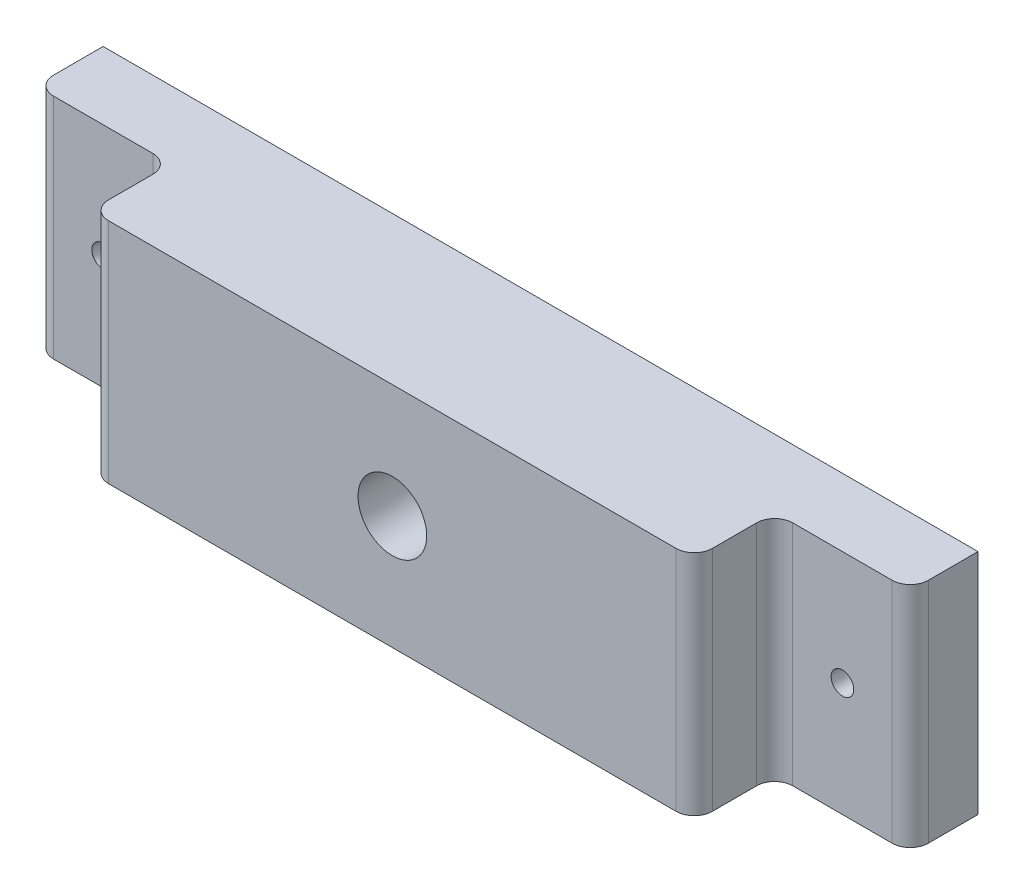
ISO-10303-21;
HEADER;
FILE_DESCRIPTION(('STEP AP214'),'2;1');
FILE_NAME('part.step','',(''),(''),'','','');
FILE_SCHEMA(('AUTOMOTIVE_DESIGN { 1 0 10303 214 1 1 1 1 }'));
ENDSEC;
DATA;
#1=APPLICATION_CONTEXT('core data for automotive mechanical design processes');
#2=APPLICATION_PROTOCOL_DEFINITION('international standard','automotive_design',2000,#1);
#3=PRODUCT_CONTEXT('',#1,'mechanical');
#4=PRODUCT('Part','Part','',(#3));
#5=PRODUCT_RELATED_PRODUCT_CATEGORY('part','',(#4));
#6=PRODUCT_DEFINITION_FORMATION('','',#4);
#7=PRODUCT_DEFINITION_CONTEXT('part definition',#1,'design');
#8=PRODUCT_DEFINITION('design','',#6,#7);
#9=PRODUCT_DEFINITION_SHAPE('','',#8);
#10=(LENGTH_UNIT() NAMED_UNIT(*) SI_UNIT(.MILLI.,.METRE.));
#11=(NAMED_UNIT(*) PLANE_ANGLE_UNIT() SI_UNIT($,.RADIAN.));
#12=(NAMED_UNIT(*) SI_UNIT($,.STERADIAN.) SOLID_ANGLE_UNIT());
#13=UNCERTAINTY_MEASURE_WITH_UNIT(LENGTH_MEASURE(1.E-05),#10,'distance_accuracy_value','');
#14=(GEOMETRIC_REPRESENTATION_CONTEXT(3) GLOBAL_UNCERTAINTY_ASSIGNED_CONTEXT((#13)) GLOBAL_UNIT_ASSIGNED_CONTEXT((#10,
#11,#12)) REPRESENTATION_CONTEXT('',''));
#15=CARTESIAN_POINT('',(0.,0.,0.));
#16=DIRECTION('',(0.,0.,1.));
#17=DIRECTION('',(1.,0.,0.));
#18=AXIS2_PLACEMENT_3D('',#15,#16,#17);
#19=CARTESIAN_POINT('',(0.,16.002,0.835084905660375));
#20=DIRECTION('',(0.,0.,-1.));
#21=DIRECTION('',(-1.,0.,0.));
#22=AXIS2_PLACEMENT_3D('',#19,#20,#21);
#23=PLANE('',#22);
#24=CARTESIAN_POINT('',(4.40426415094339,8.001,0.835084905660375));
#25=DIRECTION('',(0.,0.,1.));
#26=DIRECTION('',(1.,0.,0.));
#27=AXIS2_PLACEMENT_3D('',#24,#25,#26);
#28=CIRCLE('',#27,2.413);
#29=CARTESIAN_POINT('',(6.81726415094339,8.001,0.835084905660375));
#30=VERTEX_POINT('',#29);
#31=EDGE_CURVE('E293',#30,#30,#28,.T.);
#32=ORIENTED_EDGE('',*,*,#31,.F.);
#33=EDGE_LOOP('',(#32));
#34=FACE_BOUND('',#33,.T.);
#35=DIRECTION('',(1.,0.,0.));
#36=VECTOR('',#35,1.);
#37=CARTESIAN_POINT('',(0.,0.,0.835084905660375));
#38=LINE('',#37,#36);
#39=CARTESIAN_POINT('',(-15.5347358490566,0.,0.835084905660374));
#40=VERTEX_POINT('',#39);
#41=CARTESIAN_POINT('',(24.3432641509434,0.,0.835084905660377));
#42=VERTEX_POINT('',#41);
#43=EDGE_CURVE('E176',#40,#42,#38,.T.);
#44=ORIENTED_EDGE('',*,*,#43,.T.);
#45=DIRECTION('',(0.,-1.,0.));
#46=VECTOR('',#45,1.);
#47=CARTESIAN_POINT('',(24.3432641509434,16.002,0.835084905660377));
#48=LINE('',#47,#46);
#49=CARTESIAN_POINT('',(24.3432641509434,16.002,0.835084905660377));
#50=VERTEX_POINT('',#49);
#51=EDGE_CURVE('E237',#42,#50,#48,.F.);
#52=ORIENTED_EDGE('',*,*,#51,.T.);
#53=DIRECTION('',(1.,0.,0.));
#54=VECTOR('',#53,1.);
#55=CARTESIAN_POINT('',(0.,16.002,0.835084905660375));
#56=LINE('',#55,#54);
#57=CARTESIAN_POINT('',(-15.5347358490566,16.002,0.835084905660374));
#58=VERTEX_POINT('',#57);
#59=EDGE_CURVE('E197',#58,#50,#56,.T.);
#60=ORIENTED_EDGE('',*,*,#59,.F.);
#61=DIRECTION('',(0.,-1.,0.));
#62=VECTOR('',#61,1.);
#63=CARTESIAN_POINT('',(-15.5347358490566,16.002,0.835084905660374));
#64=LINE('',#63,#62);
#65=EDGE_CURVE('E234',#58,#40,#64,.T.);
#66=ORIENTED_EDGE('',*,*,#65,.T.);
#67=EDGE_LOOP('',(#44,#52,#60,#66));
#68=FACE_BOUND('',#67,.T.);
#69=ADVANCED_FACE('F36',(#34,#68),#23,.F.);
#70=CARTESIAN_POINT('',(25.6132641509434,16.002,0.));
#71=DIRECTION('',(1.,0.,0.));
#72=DIRECTION('',(0.,0.,-1.));
#73=AXIS2_PLACEMENT_3D('',#70,#71,#72);
#74=PLANE('',#73);
#75=DIRECTION('',(0.,0.,1.));
#76=VECTOR('',#75,1.);
#77=CARTESIAN_POINT('',(25.6132641509434,0.,0.));
#78=LINE('',#77,#76);
#79=CARTESIAN_POINT('',(25.6132641509434,0.,-3.54641509433962));
#80=VERTEX_POINT('',#79);
#81=CARTESIAN_POINT('',(25.6132641509434,0.,-0.434915094339623));
#82=VERTEX_POINT('',#81);
#83=EDGE_CURVE('E179',#80,#82,#78,.T.);
#84=ORIENTED_EDGE('',*,*,#83,.F.);
#85=DIRECTION('',(0.,-1.,0.));
#86=VECTOR('',#85,1.);
#87=CARTESIAN_POINT('',(25.6132641509434,16.002,-3.54641509433962));
#88=LINE('',#87,#86);
#89=CARTESIAN_POINT('',(25.6132641509434,16.002,-3.54641509433962));
#90=VERTEX_POINT('',#89);
#91=EDGE_CURVE('E232',#80,#90,#88,.F.);
#92=ORIENTED_EDGE('',*,*,#91,.T.);
#93=DIRECTION('',(0.,0.,1.));
#94=VECTOR('',#93,1.);
#95=CARTESIAN_POINT('',(25.6132641509434,16.002,0.));
#96=LINE('',#95,#94);
#97=CARTESIAN_POINT('',(25.6132641509434,16.002,-0.434915094339623));
#98=VERTEX_POINT('',#97);
#99=EDGE_CURVE('E167',#90,#98,#96,.T.);
#100=ORIENTED_EDGE('',*,*,#99,.T.);
#101=DIRECTION('',(0.,-1.,0.));
#102=VECTOR('',#101,1.);
#103=CARTESIAN_POINT('',(25.6132641509434,0.,-0.434915094339623));
#104=LINE('',#103,#102);
#105=EDGE_CURVE('E229',#98,#82,#104,.T.);
#106=ORIENTED_EDGE('',*,*,#105,.T.);
#107=EDGE_LOOP('',(#84,#92,#100,#106));
#108=FACE_BOUND('',#107,.T.);
#109=ADVANCED_FACE('F251',(#108),#74,.T.);
#110=CARTESIAN_POINT('',(0.,16.002,-4.81641509433962));
#111=DIRECTION('',(0.,0.,1.));
#112=DIRECTION('',(1.,0.,0.));
#113=AXIS2_PLACEMENT_3D('',#110,#111,#112);
#114=PLANE('',#113);
#115=CARTESIAN_POINT('',(30.3757641509434,8.00100000000018,-4.81641509433962));
#116=DIRECTION('',(0.,0.,1.));
#117=DIRECTION('',(-1.,0.,0.));
#118=AXIS2_PLACEMENT_3D('',#115,#116,#117);
#119=CIRCLE('',#118,0.793749999999998);
#120=CARTESIAN_POINT('',(31.1695141509434,8.00100000000018,-4.81641509433962));
#121=VERTEX_POINT('',#120);
#122=EDGE_CURVE('E299',#121,#121,#119,.T.);
#123=ORIENTED_EDGE('',*,*,#122,.F.);
#124=EDGE_LOOP('',(#123));
#125=FACE_BOUND('',#124,.T.);
#126=DIRECTION('',(-1.,0.,0.));
#127=VECTOR('',#126,1.);
#128=CARTESIAN_POINT('',(0.,0.,-4.81641509433962));
#129=LINE('',#128,#127);
#130=CARTESIAN_POINT('',(33.8682641509434,0.,-4.81641509433962));
#131=VERTEX_POINT('',#130);
#132=CARTESIAN_POINT('',(26.8832641509434,0.,-4.81641509433962));
#133=VERTEX_POINT('',#132);
#134=EDGE_CURVE('E183',#131,#133,#129,.T.);
#135=ORIENTED_EDGE('',*,*,#134,.F.);
#136=DIRECTION('',(0.,-1.,0.));
#137=VECTOR('',#136,1.);
#138=CARTESIAN_POINT('',(33.8682641509434,16.002,-4.81641509433962));
#139=LINE('',#138,#137);
#140=CARTESIAN_POINT('',(33.8682641509434,16.002,-4.81641509433962));
#141=VERTEX_POINT('',#140);
#142=EDGE_CURVE('E211',#131,#141,#139,.F.);
#143=ORIENTED_EDGE('',*,*,#142,.T.);
#144=DIRECTION('',(-1.,0.,0.));
#145=VECTOR('',#144,1.);
#146=CARTESIAN_POINT('',(0.,16.002,-4.81641509433962));
#147=LINE('',#146,#145);
#148=CARTESIAN_POINT('',(26.8832641509434,16.002,-4.81641509433962));
#149=VERTEX_POINT('',#148);
#150=EDGE_CURVE('E164',#141,#149,#147,.T.);
#151=ORIENTED_EDGE('',*,*,#150,.T.);
#152=DIRECTION('',(0.,-1.,0.));
#153=VECTOR('',#152,1.);
#154=CARTESIAN_POINT('',(26.8832641509434,0.,-4.81641509433962));
#155=LINE('',#154,#153);
#156=EDGE_CURVE('E208',#149,#133,#155,.T.);
#157=ORIENTED_EDGE('',*,*,#156,.T.);
#158=EDGE_LOOP('',(#135,#143,#151,#157));
#159=FACE_BOUND('',#158,.T.);
#160=ADVANCED_FACE('F258',(#125,#159),#114,.T.);
#161=CARTESIAN_POINT('',(35.1382641509434,16.002,0.));
#162=DIRECTION('',(1.,0.,0.));
#163=DIRECTION('',(0.,0.,-1.));
#164=AXIS2_PLACEMENT_3D('',#161,#162,#163);
#165=PLANE('',#164);
#166=DIRECTION('',(0.,0.,1.));
#167=VECTOR('',#166,1.);
#168=CARTESIAN_POINT('',(35.1382641509434,16.002,0.));
#169=LINE('',#168,#167);
#170=CARTESIAN_POINT('',(35.1382641509434,16.002,-9.57891509433962));
#171=VERTEX_POINT('',#170);
#172=CARTESIAN_POINT('',(35.1382641509434,16.002,-6.08641509433962));
#173=VERTEX_POINT('',#172);
#174=EDGE_CURVE('E143',#171,#173,#169,.T.);
#175=ORIENTED_EDGE('',*,*,#174,.T.);
#176=DIRECTION('',(0.,-1.,0.));
#177=VECTOR('',#176,1.);
#178=CARTESIAN_POINT('',(35.1382641509434,16.002,-6.08641509433962));
#179=LINE('',#178,#177);
#180=CARTESIAN_POINT('',(35.1382641509434,0.,-6.08641509433962));
#181=VERTEX_POINT('',#180);
#182=EDGE_CURVE('E149',#173,#181,#179,.T.);
#183=ORIENTED_EDGE('',*,*,#182,.T.);
#184=DIRECTION('',(0.,0.,1.));
#185=VECTOR('',#184,1.);
#186=CARTESIAN_POINT('',(35.1382641509434,0.,0.));
#187=LINE('',#186,#185);
#188=CARTESIAN_POINT('',(35.1382641509434,0.,-9.57891509433962));
#189=VERTEX_POINT('',#188);
#190=EDGE_CURVE('E146',#189,#181,#187,.T.);
#191=ORIENTED_EDGE('',*,*,#190,.F.);
#192=DIRECTION('',(0.,-1.,0.));
#193=VECTOR('',#192,1.);
#194=CARTESIAN_POINT('',(35.1382641509434,16.002,-9.57891509433962));
#195=LINE('',#194,#193);
#196=EDGE_CURVE('E138',#171,#189,#195,.T.);
#197=ORIENTED_EDGE('',*,*,#196,.F.);
#198=EDGE_LOOP('',(#175,#183,#191,#197));
#199=FACE_BOUND('',#198,.T.);
#200=ADVANCED_FACE('F140',(#199),#165,.T.);
#201=CARTESIAN_POINT('',(0.,16.002,-9.57891509433962));
#202=DIRECTION('',(0.,0.,1.));
#203=DIRECTION('',(1.,0.,0.));
#204=AXIS2_PLACEMENT_3D('',#201,#202,#203);
#205=PLANE('',#204);
#206=CARTESIAN_POINT('',(-21.5672358490566,8.001,-9.57891509433962));
#207=DIRECTION('',(0.,0.,1.));
#208=DIRECTION('',(1.,0.,0.));
#209=AXIS2_PLACEMENT_3D('',#206,#207,#208);
#210=CIRCLE('',#209,0.793749999999999);
#211=CARTESIAN_POINT('',(-20.7734858490566,8.001,-9.57891509433962));
#212=VERTEX_POINT('',#211);
#213=EDGE_CURVE('E296',#212,#212,#210,.T.);
#214=ORIENTED_EDGE('',*,*,#213,.T.);
#215=EDGE_LOOP('',(#214));
#216=FACE_BOUND('',#215,.T.);
#217=CARTESIAN_POINT('',(30.3757641509434,8.00100000000018,-9.57891509433962));
#218=DIRECTION('',(0.,0.,1.));
#219=DIRECTION('',(-1.,0.,0.));
#220=AXIS2_PLACEMENT_3D('',#217,#218,#219);
#221=CIRCLE('',#220,0.793749999999998);
#222=CARTESIAN_POINT('',(31.1695141509434,8.00100000000018,-9.57891509433962));
#223=VERTEX_POINT('',#222);
#224=EDGE_CURVE('E302',#223,#223,#221,.T.);
#225=ORIENTED_EDGE('',*,*,#224,.T.);
#226=EDGE_LOOP('',(#225));
#227=FACE_BOUND('',#226,.T.);
#228=CARTESIAN_POINT('',(4.40426415094339,8.001,-9.57891509433962));
#229=DIRECTION('',(0.,0.,1.));
#230=DIRECTION('',(1.,0.,0.));
#231=AXIS2_PLACEMENT_3D('',#228,#229,#230);
#232=CIRCLE('',#231,2.413);
#233=CARTESIAN_POINT('',(6.81726415094339,8.001,-9.57891509433962));
#234=VERTEX_POINT('',#233);
#235=EDGE_CURVE('E180',#234,#234,#232,.T.);
#236=ORIENTED_EDGE('',*,*,#235,.T.);
#237=EDGE_LOOP('',(#236));
#238=FACE_BOUND('',#237,.T.);
#239=DIRECTION('',(-1.,0.,0.));
#240=VECTOR('',#239,1.);
#241=CARTESIAN_POINT('',(0.,0.,-9.57891509433962));
#242=LINE('',#241,#240);
#243=CARTESIAN_POINT('',(-26.3297358490566,0.,-9.57891509433962));
#244=VERTEX_POINT('',#243);
#245=EDGE_CURVE('E187',#189,#244,#242,.T.);
#246=ORIENTED_EDGE('',*,*,#245,.T.);
#247=DIRECTION('',(0.,-1.,0.));
#248=VECTOR('',#247,1.);
#249=CARTESIAN_POINT('',(-26.3297358490566,16.002,-9.57891509433962));
#250=LINE('',#249,#248);
#251=CARTESIAN_POINT('',(-26.3297358490566,16.002,-9.57891509433962));
#252=VERTEX_POINT('',#251);
#253=EDGE_CURVE('E150',#252,#244,#250,.T.);
#254=ORIENTED_EDGE('',*,*,#253,.F.);
#255=DIRECTION('',(-1.,0.,0.));
#256=VECTOR('',#255,1.);
#257=CARTESIAN_POINT('',(0.,16.002,-9.57891509433962));
#258=LINE('',#257,#256);
#259=EDGE_CURVE('E153',#171,#252,#258,.T.);
#260=ORIENTED_EDGE('',*,*,#259,.F.);
#261=ORIENTED_EDGE('',*,*,#196,.T.);
#262=EDGE_LOOP('',(#246,#254,#260,#261));
#263=FACE_BOUND('',#262,.T.);
#264=ADVANCED_FACE('F154',(#216,#227,#238,#263),#205,.F.);
#265=CARTESIAN_POINT('',(-26.3297358490566,16.002,0.));
#266=DIRECTION('',(1.,0.,0.));
#267=DIRECTION('',(0.,0.,-1.));
#268=AXIS2_PLACEMENT_3D('',#265,#266,#267);
#269=PLANE('',#268);
#270=DIRECTION('',(0.,0.,1.));
#271=VECTOR('',#270,1.);
#272=CARTESIAN_POINT('',(-26.3297358490566,0.,0.));
#273=LINE('',#272,#271);
#274=CARTESIAN_POINT('',(-26.3297358490566,0.,-6.08641509433962));
#275=VERTEX_POINT('',#274);
#276=EDGE_CURVE('E189',#244,#275,#273,.T.);
#277=ORIENTED_EDGE('',*,*,#276,.T.);
#278=DIRECTION('',(0.,-1.,0.));
#279=VECTOR('',#278,1.);
#280=CARTESIAN_POINT('',(-26.3297358490566,16.002,-6.08641509433962));
#281=LINE('',#280,#279);
#282=CARTESIAN_POINT('',(-26.3297358490566,16.002,-6.08641509433962));
#283=VERTEX_POINT('',#282);
#284=EDGE_CURVE('E239',#275,#283,#281,.F.);
#285=ORIENTED_EDGE('',*,*,#284,.T.);
#286=DIRECTION('',(0.,0.,1.));
#287=VECTOR('',#286,1.);
#288=CARTESIAN_POINT('',(-26.3297358490566,16.002,0.));
#289=LINE('',#288,#287);
#290=EDGE_CURVE('E158',#252,#283,#289,.T.);
#291=ORIENTED_EDGE('',*,*,#290,.F.);
#292=ORIENTED_EDGE('',*,*,#253,.T.);
#293=EDGE_LOOP('',(#277,#285,#291,#292));
#294=FACE_BOUND('',#293,.T.);
#295=ADVANCED_FACE('F264',(#294),#269,.F.);
#296=CARTESIAN_POINT('',(0.,16.002,-4.81641509433962));
#297=DIRECTION('',(0.,0.,-1.));
#298=DIRECTION('',(-1.,0.,0.));
#299=AXIS2_PLACEMENT_3D('',#296,#297,#298);
#300=PLANE('',#299);
#301=CARTESIAN_POINT('',(-21.5672358490566,8.001,-4.81641509433962));
#302=DIRECTION('',(0.,0.,1.));
#303=DIRECTION('',(1.,0.,0.));
#304=AXIS2_PLACEMENT_3D('',#301,#302,#303);
#305=CIRCLE('',#304,0.793749999999999);
#306=CARTESIAN_POINT('',(-20.7734858490566,8.001,-4.81641509433962));
#307=VERTEX_POINT('',#306);
#308=EDGE_CURVE('E305',#307,#307,#305,.T.);
#309=ORIENTED_EDGE('',*,*,#308,.F.);
#310=EDGE_LOOP('',(#309));
#311=FACE_BOUND('',#310,.T.);
#312=DIRECTION('',(1.,0.,0.));
#313=VECTOR('',#312,1.);
#314=CARTESIAN_POINT('',(0.,0.,-4.81641509433962));
#315=LINE('',#314,#313);
#316=CARTESIAN_POINT('',(-25.0597358490566,0.,-4.81641509433962));
#317=VERTEX_POINT('',#316);
#318=CARTESIAN_POINT('',(-18.0747358490566,0.,-4.81641509433962));
#319=VERTEX_POINT('',#318);
#320=EDGE_CURVE('E192',#317,#319,#315,.T.);
#321=ORIENTED_EDGE('',*,*,#320,.T.);
#322=DIRECTION('',(0.,-1.,0.));
#323=VECTOR('',#322,1.);
#324=CARTESIAN_POINT('',(-18.0747358490566,16.002,-4.81641509433962));
#325=LINE('',#324,#323);
#326=CARTESIAN_POINT('',(-18.0747358490566,16.002,-4.81641509433962));
#327=VERTEX_POINT('',#326);
#328=EDGE_CURVE('E227',#319,#327,#325,.F.);
#329=ORIENTED_EDGE('',*,*,#328,.T.);
#330=DIRECTION('',(1.,0.,0.));
#331=VECTOR('',#330,1.);
#332=CARTESIAN_POINT('',(0.,16.002,-4.81641509433962));
#333=LINE('',#332,#331);
#334=CARTESIAN_POINT('',(-25.0597358490566,16.002,-4.81641509433962));
#335=VERTEX_POINT('',#334);
#336=EDGE_CURVE('E172',#335,#327,#333,.T.);
#337=ORIENTED_EDGE('',*,*,#336,.F.);
#338=DIRECTION('',(0.,-1.,0.));
#339=VECTOR('',#338,1.);
#340=CARTESIAN_POINT('',(-25.0597358490566,16.002,-4.81641509433962));
#341=LINE('',#340,#339);
#342=EDGE_CURVE('E224',#335,#317,#341,.T.);
#343=ORIENTED_EDGE('',*,*,#342,.T.);
#344=EDGE_LOOP('',(#321,#329,#337,#343));
#345=FACE_BOUND('',#344,.T.);
#346=ADVANCED_FACE('F272',(#311,#345),#300,.F.);
#347=CARTESIAN_POINT('',(-16.8047358490566,16.002,0.));
#348=DIRECTION('',(1.,0.,0.));
#349=DIRECTION('',(0.,0.,-1.));
#350=AXIS2_PLACEMENT_3D('',#347,#348,#349);
#351=PLANE('',#350);
#352=DIRECTION('',(0.,0.,1.));
#353=VECTOR('',#352,1.);
#354=CARTESIAN_POINT('',(-16.8047358490566,16.002,0.));
#355=LINE('',#354,#353);
#356=CARTESIAN_POINT('',(-16.8047358490566,16.002,-3.54641509433962));
#357=VERTEX_POINT('',#356);
#358=CARTESIAN_POINT('',(-16.8047358490566,16.002,-0.434915094339626));
#359=VERTEX_POINT('',#358);
#360=EDGE_CURVE('E174',#357,#359,#355,.T.);
#361=ORIENTED_EDGE('',*,*,#360,.F.);
#362=DIRECTION('',(0.,-1.,0.));
#363=VECTOR('',#362,1.);
#364=CARTESIAN_POINT('',(-16.8047358490566,0.,-3.54641509433962));
#365=LINE('',#364,#363);
#366=CARTESIAN_POINT('',(-16.8047358490566,0.,-3.54641509433962));
#367=VERTEX_POINT('',#366);
#368=EDGE_CURVE('E221',#357,#367,#365,.T.);
#369=ORIENTED_EDGE('',*,*,#368,.T.);
#370=DIRECTION('',(0.,0.,1.));
#371=VECTOR('',#370,1.);
#372=CARTESIAN_POINT('',(-16.8047358490566,0.,0.));
#373=LINE('',#372,#371);
#374=CARTESIAN_POINT('',(-16.8047358490566,0.,-0.434915094339626));
#375=VERTEX_POINT('',#374);
#376=EDGE_CURVE('E195',#367,#375,#373,.T.);
#377=ORIENTED_EDGE('',*,*,#376,.T.);
#378=DIRECTION('',(0.,-1.,0.));
#379=VECTOR('',#378,1.);
#380=CARTESIAN_POINT('',(-16.8047358490566,16.002,-0.434915094339626));
#381=LINE('',#380,#379);
#382=EDGE_CURVE('E51',#375,#359,#381,.F.);
#383=ORIENTED_EDGE('',*,*,#382,.T.);
#384=EDGE_LOOP('',(#361,#369,#377,#383));
#385=FACE_BOUND('',#384,.T.);
#386=ADVANCED_FACE('F278',(#385),#351,.F.);
#387=CARTESIAN_POINT('',(0.,16.002,0.));
#388=DIRECTION('',(0.,1.,0.));
#389=DIRECTION('',(0.,0.,1.));
#390=AXIS2_PLACEMENT_3D('',#387,#388,#389);
#391=PLANE('',#390);
#392=ORIENTED_EDGE('',*,*,#150,.F.);
#393=CARTESIAN_POINT('',(33.8682641509434,16.002,-6.08641509433962));
#394=DIRECTION('',(0.,1.,0.));
#395=DIRECTION('',(0.,0.,1.));
#396=AXIS2_PLACEMENT_3D('',#393,#394,#395);
#397=CIRCLE('',#396,1.27);
#398=EDGE_CURVE('E163',#141,#173,#397,.T.);
#399=ORIENTED_EDGE('',*,*,#398,.T.);
#400=ORIENTED_EDGE('',*,*,#174,.F.);
#401=ORIENTED_EDGE('',*,*,#259,.T.);
#402=ORIENTED_EDGE('',*,*,#290,.T.);
#403=CARTESIAN_POINT('',(-25.0597358490566,16.002,-6.08641509433962));
#404=DIRECTION('',(0.,1.,0.));
#405=DIRECTION('',(0.,0.,1.));
#406=AXIS2_PLACEMENT_3D('',#403,#404,#405);
#407=CIRCLE('',#406,1.27);
#408=EDGE_CURVE('E213',#283,#335,#407,.T.);
#409=ORIENTED_EDGE('',*,*,#408,.T.);
#410=ORIENTED_EDGE('',*,*,#336,.T.);
#411=CARTESIAN_POINT('',(-18.0747358490566,16.002,-3.54641509433962));
#412=DIRECTION('',(0.,1.,0.));
#413=DIRECTION('',(0.,0.,1.));
#414=AXIS2_PLACEMENT_3D('',#411,#412,#413);
#415=CIRCLE('',#414,1.27);
#416=EDGE_CURVE('E58',#327,#357,#415,.F.);
#417=ORIENTED_EDGE('',*,*,#416,.T.);
#418=ORIENTED_EDGE('',*,*,#360,.T.);
#419=CARTESIAN_POINT('',(-15.5347358490566,16.002,-0.434915094339626));
#420=DIRECTION('',(0.,1.,0.));
#421=DIRECTION('',(0.,0.,1.));
#422=AXIS2_PLACEMENT_3D('',#419,#420,#421);
#423=CIRCLE('',#422,1.27);
#424=EDGE_CURVE('E215',#359,#58,#423,.T.);
#425=ORIENTED_EDGE('',*,*,#424,.T.);
#426=ORIENTED_EDGE('',*,*,#59,.T.);
#427=CARTESIAN_POINT('',(24.3432641509434,16.002,-0.434915094339623));
#428=DIRECTION('',(0.,1.,0.));
#429=DIRECTION('',(0.,0.,1.));
#430=AXIS2_PLACEMENT_3D('',#427,#428,#429);
#431=CIRCLE('',#430,1.27);
#432=EDGE_CURVE('E217',#50,#98,#431,.T.);
#433=ORIENTED_EDGE('',*,*,#432,.T.);
#434=ORIENTED_EDGE('',*,*,#99,.F.);
#435=CARTESIAN_POINT('',(26.8832641509434,16.002,-3.54641509433962));
#436=DIRECTION('',(0.,1.,0.));
#437=DIRECTION('',(0.,0.,1.));
#438=AXIS2_PLACEMENT_3D('',#435,#436,#437);
#439=CIRCLE('',#438,1.27);
#440=EDGE_CURVE('E12',#90,#149,#439,.F.);
#441=ORIENTED_EDGE('',*,*,#440,.T.);
#442=EDGE_LOOP('',(#392,#399,#400,#401,#402,#409,#410,#417,#418,#425,#426,#433,#434,#441));
#443=FACE_BOUND('',#442,.T.);
#444=ADVANCED_FACE('F161',(#443),#391,.T.);
#445=CARTESIAN_POINT('',(0.,0.,0.));
#446=DIRECTION('',(0.,1.,0.));
#447=DIRECTION('',(0.,0.,1.));
#448=AXIS2_PLACEMENT_3D('',#445,#446,#447);
#449=PLANE('',#448);
#450=ORIENTED_EDGE('',*,*,#190,.T.);
#451=CARTESIAN_POINT('',(33.8682641509434,0.,-6.08641509433962));
#452=DIRECTION('',(0.,1.,0.));
#453=DIRECTION('',(0.,0.,1.));
#454=AXIS2_PLACEMENT_3D('',#451,#452,#453);
#455=CIRCLE('',#454,1.27);
#456=EDGE_CURVE('E206',#181,#131,#455,.F.);
#457=ORIENTED_EDGE('',*,*,#456,.T.);
#458=ORIENTED_EDGE('',*,*,#134,.T.);
#459=CARTESIAN_POINT('',(26.8832641509434,0.,-3.54641509433962));
#460=DIRECTION('',(0.,1.,0.));
#461=DIRECTION('',(0.,0.,1.));
#462=AXIS2_PLACEMENT_3D('',#459,#460,#461);
#463=CIRCLE('',#462,1.27);
#464=EDGE_CURVE('E44',#133,#80,#463,.T.);
#465=ORIENTED_EDGE('',*,*,#464,.T.);
#466=ORIENTED_EDGE('',*,*,#83,.T.);
#467=CARTESIAN_POINT('',(24.3432641509434,0.,-0.434915094339623));
#468=DIRECTION('',(0.,1.,0.));
#469=DIRECTION('',(0.,0.,1.));
#470=AXIS2_PLACEMENT_3D('',#467,#468,#469);
#471=CIRCLE('',#470,1.27);
#472=EDGE_CURVE('E204',#82,#42,#471,.F.);
#473=ORIENTED_EDGE('',*,*,#472,.T.);
#474=ORIENTED_EDGE('',*,*,#43,.F.);
#475=CARTESIAN_POINT('',(-15.5347358490566,0.,-0.434915094339626));
#476=DIRECTION('',(0.,1.,0.));
#477=DIRECTION('',(0.,0.,1.));
#478=AXIS2_PLACEMENT_3D('',#475,#476,#477);
#479=CIRCLE('',#478,1.27);
#480=EDGE_CURVE('E202',#40,#375,#479,.F.);
#481=ORIENTED_EDGE('',*,*,#480,.T.);
#482=ORIENTED_EDGE('',*,*,#376,.F.);
#483=CARTESIAN_POINT('',(-18.0747358490566,0.,-3.54641509433962));
#484=DIRECTION('',(0.,1.,0.));
#485=DIRECTION('',(0.,0.,1.));
#486=AXIS2_PLACEMENT_3D('',#483,#484,#485);
#487=CIRCLE('',#486,1.27);
#488=EDGE_CURVE('E241',#367,#319,#487,.T.);
#489=ORIENTED_EDGE('',*,*,#488,.T.);
#490=ORIENTED_EDGE('',*,*,#320,.F.);
#491=CARTESIAN_POINT('',(-25.0597358490566,0.,-6.08641509433962));
#492=DIRECTION('',(0.,1.,0.));
#493=DIRECTION('',(0.,0.,1.));
#494=AXIS2_PLACEMENT_3D('',#491,#492,#493);
#495=CIRCLE('',#494,1.27);
#496=EDGE_CURVE('E200',#317,#275,#495,.F.);
#497=ORIENTED_EDGE('',*,*,#496,.T.);
#498=ORIENTED_EDGE('',*,*,#276,.F.);
#499=ORIENTED_EDGE('',*,*,#245,.F.);
#500=EDGE_LOOP('',(#450,#457,#458,#465,#466,#473,#474,#481,#482,#489,#490,#497,#498,#499));
#501=FACE_BOUND('',#500,.T.);
#502=ADVANCED_FACE('F245',(#501),#449,.F.);
#503=CARTESIAN_POINT('',(33.8682641509434,16.002,-6.08641509433962));
#504=DIRECTION('',(0.,-1.,0.));
#505=DIRECTION('',(0.,0.,-1.));
#506=AXIS2_PLACEMENT_3D('',#503,#504,#505);
#507=CYLINDRICAL_SURFACE('',#506,1.27);
#508=ORIENTED_EDGE('',*,*,#398,.F.);
#509=ORIENTED_EDGE('',*,*,#142,.F.);
#510=ORIENTED_EDGE('',*,*,#456,.F.);
#511=ORIENTED_EDGE('',*,*,#182,.F.);
#512=EDGE_LOOP('',(#508,#509,#510,#511));
#513=FACE_BOUND('',#512,.T.);
#514=ADVANCED_FACE('F261',(#513),#507,.T.);
#515=CARTESIAN_POINT('',(-18.0747358490566,16.002,-3.54641509433962));
#516=DIRECTION('',(0.,1.,0.));
#517=DIRECTION('',(0.,0.,1.));
#518=AXIS2_PLACEMENT_3D('',#515,#516,#517);
#519=CYLINDRICAL_SURFACE('',#518,1.27);
#520=ORIENTED_EDGE('',*,*,#416,.F.);
#521=ORIENTED_EDGE('',*,*,#328,.F.);
#522=ORIENTED_EDGE('',*,*,#488,.F.);
#523=ORIENTED_EDGE('',*,*,#368,.F.);
#524=EDGE_LOOP('',(#520,#521,#522,#523));
#525=FACE_BOUND('',#524,.T.);
#526=ADVANCED_FACE('F277',(#525),#519,.F.);
#527=CARTESIAN_POINT('',(26.8832641509434,16.002,-3.54641509433962));
#528=DIRECTION('',(0.,1.,0.));
#529=DIRECTION('',(0.,0.,1.));
#530=AXIS2_PLACEMENT_3D('',#527,#528,#529);
#531=CYLINDRICAL_SURFACE('',#530,1.27);
#532=ORIENTED_EDGE('',*,*,#440,.F.);
#533=ORIENTED_EDGE('',*,*,#91,.F.);
#534=ORIENTED_EDGE('',*,*,#464,.F.);
#535=ORIENTED_EDGE('',*,*,#156,.F.);
#536=EDGE_LOOP('',(#532,#533,#534,#535));
#537=FACE_BOUND('',#536,.T.);
#538=ADVANCED_FACE('F256',(#537),#531,.F.);
#539=CARTESIAN_POINT('',(24.3432641509434,16.002,-0.434915094339623));
#540=DIRECTION('',(0.,1.,0.));
#541=DIRECTION('',(0.,0.,1.));
#542=AXIS2_PLACEMENT_3D('',#539,#540,#541);
#543=CYLINDRICAL_SURFACE('',#542,1.27);
#544=ORIENTED_EDGE('',*,*,#432,.F.);
#545=ORIENTED_EDGE('',*,*,#51,.F.);
#546=ORIENTED_EDGE('',*,*,#472,.F.);
#547=ORIENTED_EDGE('',*,*,#105,.F.);
#548=EDGE_LOOP('',(#544,#545,#546,#547));
#549=FACE_BOUND('',#548,.T.);
#550=ADVANCED_FACE('F290',(#549),#543,.T.);
#551=CARTESIAN_POINT('',(-15.5347358490566,16.002,-0.434915094339626));
#552=DIRECTION('',(0.,-1.,0.));
#553=DIRECTION('',(0.,0.,-1.));
#554=AXIS2_PLACEMENT_3D('',#551,#552,#553);
#555=CYLINDRICAL_SURFACE('',#554,1.27);
#556=ORIENTED_EDGE('',*,*,#424,.F.);
#557=ORIENTED_EDGE('',*,*,#382,.F.);
#558=ORIENTED_EDGE('',*,*,#480,.F.);
#559=ORIENTED_EDGE('',*,*,#65,.F.);
#560=EDGE_LOOP('',(#556,#557,#558,#559));
#561=FACE_BOUND('',#560,.T.);
#562=ADVANCED_FACE('F284',(#561),#555,.T.);
#563=CARTESIAN_POINT('',(-25.0597358490566,16.002,-6.08641509433962));
#564=DIRECTION('',(0.,-1.,0.));
#565=DIRECTION('',(0.,0.,-1.));
#566=AXIS2_PLACEMENT_3D('',#563,#564,#565);
#567=CYLINDRICAL_SURFACE('',#566,1.27);
#568=ORIENTED_EDGE('',*,*,#408,.F.);
#569=ORIENTED_EDGE('',*,*,#284,.F.);
#570=ORIENTED_EDGE('',*,*,#496,.F.);
#571=ORIENTED_EDGE('',*,*,#342,.F.);
#572=EDGE_LOOP('',(#568,#569,#570,#571));
#573=FACE_BOUND('',#572,.T.);
#574=ADVANCED_FACE('F38',(#573),#567,.T.);
#575=CARTESIAN_POINT('',(4.40426415094339,8.001,-9.57891509433962));
#576=DIRECTION('',(0.,0.,1.));
#577=DIRECTION('',(1.,0.,0.));
#578=AXIS2_PLACEMENT_3D('',#575,#576,#577);
#579=CYLINDRICAL_SURFACE('',#578,2.413);
#580=ORIENTED_EDGE('',*,*,#235,.F.);
#581=EDGE_LOOP('',(#580));
#582=FACE_BOUND('',#581,.T.);
#583=ORIENTED_EDGE('',*,*,#31,.T.);
#584=EDGE_LOOP('',(#583));
#585=FACE_BOUND('',#584,.T.);
#586=ADVANCED_FACE('F317',(#582,#585),#579,.F.);
#587=CARTESIAN_POINT('',(-21.5672358490566,8.001,-9.57891509433962));
#588=DIRECTION('',(0.,0.,1.));
#589=DIRECTION('',(1.,0.,0.));
#590=AXIS2_PLACEMENT_3D('',#587,#588,#589);
#591=CYLINDRICAL_SURFACE('',#590,0.793749999999999);
#592=CARTESIAN_POINT('',(-20.7734858490566,8.001,-9.57891509433962));
#593=CARTESIAN_POINT('',(-20.7734858490566,8.001,-9.52930571933963));
#594=CARTESIAN_POINT('',(-20.7734858490566,8.001,-9.47969634433963));
#595=CARTESIAN_POINT('',(-20.7734858490566,8.001,-9.38047759433962));
#596=CARTESIAN_POINT('',(-20.7734858490566,8.001,-9.33086821933963));
#597=CARTESIAN_POINT('',(-20.7734858490566,8.001,-9.23164946933962));
#598=CARTESIAN_POINT('',(-20.7734858490566,8.001,-9.18204009433962));
#599=CARTESIAN_POINT('',(-20.7734858490566,8.001,-9.08282134433962));
#600=CARTESIAN_POINT('',(-20.7734858490566,8.001,-9.03321196933963));
#601=CARTESIAN_POINT('',(-20.7734858490566,8.001,-8.93399321933962));
#602=CARTESIAN_POINT('',(-20.7734858490566,8.001,-8.88438384433963));
#603=CARTESIAN_POINT('',(-20.7734858490566,8.001,-8.78516509433962));
#604=CARTESIAN_POINT('',(-20.7734858490566,8.001,-8.73555571933963));
#605=CARTESIAN_POINT('',(-20.7734858490566,8.001,-8.63633696933962));
#606=CARTESIAN_POINT('',(-20.7734858490566,8.001,-8.58672759433962));
#607=CARTESIAN_POINT('',(-20.7734858490566,8.001,-8.48750884433962));
#608=CARTESIAN_POINT('',(-20.7734858490566,8.001,-8.43789946933962));
#609=CARTESIAN_POINT('',(-20.7734858490566,8.001,-8.33868071933962));
#610=CARTESIAN_POINT('',(-20.7734858490566,8.001,-8.28907134433963));
#611=CARTESIAN_POINT('',(-20.7734858490566,8.001,-8.18985259433962));
#612=CARTESIAN_POINT('',(-20.7734858490566,8.001,-8.14024321933963));
#613=CARTESIAN_POINT('',(-20.7734858490566,8.001,-8.04102446933962));
#614=CARTESIAN_POINT('',(-20.7734858490566,8.001,-7.99141509433962));
#615=CARTESIAN_POINT('',(-20.7734858490566,8.001,-7.89219634433962));
#616=CARTESIAN_POINT('',(-20.7734858490566,8.001,-7.84258696933962));
#617=CARTESIAN_POINT('',(-20.7734858490566,8.001,-7.74336821933962));
#618=CARTESIAN_POINT('',(-20.7734858490566,8.001,-7.69375884433962));
#619=CARTESIAN_POINT('',(-20.7734858490566,8.001,-7.59454009433962));
#620=CARTESIAN_POINT('',(-20.7734858490566,8.001,-7.54493071933962));
#621=CARTESIAN_POINT('',(-20.7734858490566,8.001,-7.44571196933962));
#622=CARTESIAN_POINT('',(-20.7734858490566,8.001,-7.39610259433962));
#623=CARTESIAN_POINT('',(-20.7734858490566,8.001,-7.29688384433962));
#624=CARTESIAN_POINT('',(-20.7734858490566,8.001,-7.24727446933962));
#625=CARTESIAN_POINT('',(-20.7734858490566,8.001,-7.14805571933962));
#626=CARTESIAN_POINT('',(-20.7734858490566,8.001,-7.09844634433962));
#627=CARTESIAN_POINT('',(-20.7734858490566,8.001,-6.99922759433962));
#628=CARTESIAN_POINT('',(-20.7734858490566,8.001,-6.94961821933962));
#629=CARTESIAN_POINT('',(-20.7734858490566,8.001,-6.85039946933962));
#630=CARTESIAN_POINT('',(-20.7734858490566,8.001,-6.80079009433962));
#631=CARTESIAN_POINT('',(-20.7734858490566,8.001,-6.70157134433962));
#632=CARTESIAN_POINT('',(-20.7734858490566,8.001,-6.65196196933962));
#633=CARTESIAN_POINT('',(-20.7734858490566,8.001,-6.55274321933962));
#634=CARTESIAN_POINT('',(-20.7734858490566,8.001,-6.50313384433962));
#635=CARTESIAN_POINT('',(-20.7734858490566,8.001,-6.40391509433962));
#636=CARTESIAN_POINT('',(-20.7734858490566,8.001,-6.35430571933962));
#637=CARTESIAN_POINT('',(-20.7734858490566,8.001,-6.25508696933962));
#638=CARTESIAN_POINT('',(-20.7734858490566,8.001,-6.20547759433962));
#639=CARTESIAN_POINT('',(-20.7734858490566,8.001,-6.10625884433962));
#640=CARTESIAN_POINT('',(-20.7734858490566,8.001,-6.05664946933962));
#641=CARTESIAN_POINT('',(-20.7734858490566,8.001,-5.95743071933962));
#642=CARTESIAN_POINT('',(-20.7734858490566,8.001,-5.90782134433962));
#643=CARTESIAN_POINT('',(-20.7734858490566,8.001,-5.80860259433962));
#644=CARTESIAN_POINT('',(-20.7734858490566,8.001,-5.75899321933962));
#645=CARTESIAN_POINT('',(-20.7734858490566,8.001,-5.65977446933962));
#646=CARTESIAN_POINT('',(-20.7734858490566,8.001,-5.61016509433962));
#647=CARTESIAN_POINT('',(-20.7734858490566,8.001,-5.51094634433962));
#648=CARTESIAN_POINT('',(-20.7734858490566,8.001,-5.46133696933962));
#649=CARTESIAN_POINT('',(-20.7734858490566,8.001,-5.36211821933962));
#650=CARTESIAN_POINT('',(-20.7734858490566,8.001,-5.31250884433962));
#651=CARTESIAN_POINT('',(-20.7734858490566,8.001,-5.21329009433962));
#652=CARTESIAN_POINT('',(-20.7734858490566,8.001,-5.16368071933962));
#653=CARTESIAN_POINT('',(-20.7734858490566,8.001,-5.06446196933962));
#654=CARTESIAN_POINT('',(-20.7734858490566,8.001,-5.01485259433962));
#655=CARTESIAN_POINT('',(-20.7734858490566,8.001,-4.91563384433962));
#656=CARTESIAN_POINT('',(-20.7734858490566,8.001,-4.86602446933962));
#657=CARTESIAN_POINT('',(-20.7734858490566,8.001,-4.81641509433962));
#658=B_SPLINE_CURVE_WITH_KNOTS('',3,(#592,#593,#594,#595,#596,#597,#598,#599,#600,#601,#602,
#603,#604,#605,#606,#607,#608,#609,#610,#611,#612,#613,#614,#615,#616,#617,#618,#619,#620,#621,
#622,#623,#624,#625,#626,#627,#628,#629,#630,#631,#632,#633,#634,#635,#636,#637,#638,#639,#640,
#641,#642,#643,#644,#645,#646,#647,#648,#649,#650,#651,#652,#653,#654,#655,#656,#657),
.UNSPECIFIED.,.F.,.F.,(4,2,2,2,2,2,2,2,2,2,2,2,2,2,2,2,2,2,2,2,2,2,2,2,2,2,2,2,2,2,2,2,4),(0.,
0.148828125,0.29765625,0.446484375,0.5953125,0.744140625,0.892968750000001,1.041796875,1.190625,
1.339453125,1.48828125,1.637109375,1.7859375,1.934765625,2.08359375,2.232421875,2.38125,
2.530078125,2.67890625,2.827734375,2.9765625,3.125390625,3.27421875,3.423046875,3.571875,
3.720703125,3.86953125,4.018359375,4.1671875,4.316015625,4.46484375,4.613671875,4.7625),.UNSPECIFIED.);
#659=EDGE_CURVE('BSEAM313',#212,#307,#658,.T.);
#660=ORIENTED_EDGE('',*,*,#213,.F.);
#661=ORIENTED_EDGE('',*,*,#308,.T.);
#662=ORIENTED_EDGE('',*,*,#659,.T.);
#663=ORIENTED_EDGE('',*,*,#659,.F.);
#664=EDGE_LOOP('',(#660,#662,#661,#663));
#665=FACE_BOUND('',#664,.T.);
#666=ADVANCED_FACE('F313',(#665),#591,.F.);
#667=CARTESIAN_POINT('',(30.3757641509434,8.00100000000018,-9.57891509433962));
#668=DIRECTION('',(0.,0.,1.));
#669=DIRECTION('',(1.,0.,0.));
#670=AXIS2_PLACEMENT_3D('',#667,#668,#669);
#671=CYLINDRICAL_SURFACE('',#670,0.793749999999998);
#672=CARTESIAN_POINT('',(31.1695141509434,8.00100000000018,-9.57891509433962));
#673=CARTESIAN_POINT('',(31.1695141509434,8.00100000000018,-9.52930571933963));
#674=CARTESIAN_POINT('',(31.1695141509434,8.00100000000018,-9.47969634433963));
#675=CARTESIAN_POINT('',(31.1695141509434,8.00100000000018,-9.38047759433962));
#676=CARTESIAN_POINT('',(31.1695141509434,8.00100000000018,-9.33086821933963));
#677=CARTESIAN_POINT('',(31.1695141509434,8.00100000000018,-9.23164946933962));
#678=CARTESIAN_POINT('',(31.1695141509434,8.00100000000018,-9.18204009433962));
#679=CARTESIAN_POINT('',(31.1695141509434,8.00100000000018,-9.08282134433962));
#680=CARTESIAN_POINT('',(31.1695141509434,8.00100000000018,-9.03321196933963));
#681=CARTESIAN_POINT('',(31.1695141509434,8.00100000000018,-8.93399321933962));
#682=CARTESIAN_POINT('',(31.1695141509434,8.00100000000018,-8.88438384433963));
#683=CARTESIAN_POINT('',(31.1695141509434,8.00100000000018,-8.78516509433962));
#684=CARTESIAN_POINT('',(31.1695141509434,8.00100000000018,-8.73555571933963));
#685=CARTESIAN_POINT('',(31.1695141509434,8.00100000000018,-8.63633696933962));
#686=CARTESIAN_POINT('',(31.1695141509434,8.00100000000018,-8.58672759433962));
#687=CARTESIAN_POINT('',(31.1695141509434,8.00100000000018,-8.48750884433962));
#688=CARTESIAN_POINT('',(31.1695141509434,8.00100000000018,-8.43789946933962));
#689=CARTESIAN_POINT('',(31.1695141509434,8.00100000000018,-8.33868071933962));
#690=CARTESIAN_POINT('',(31.1695141509434,8.00100000000018,-8.28907134433963));
#691=CARTESIAN_POINT('',(31.1695141509434,8.00100000000018,-8.18985259433962));
#692=CARTESIAN_POINT('',(31.1695141509434,8.00100000000018,-8.14024321933963));
#693=CARTESIAN_POINT('',(31.1695141509434,8.00100000000018,-8.04102446933962));
#694=CARTESIAN_POINT('',(31.1695141509434,8.00100000000018,-7.99141509433962));
#695=CARTESIAN_POINT('',(31.1695141509434,8.00100000000018,-7.89219634433962));
#696=CARTESIAN_POINT('',(31.1695141509434,8.00100000000018,-7.84258696933962));
#697=CARTESIAN_POINT('',(31.1695141509434,8.00100000000018,-7.74336821933962));
#698=CARTESIAN_POINT('',(31.1695141509434,8.00100000000018,-7.69375884433962));
#699=CARTESIAN_POINT('',(31.1695141509434,8.00100000000018,-7.59454009433962));
#700=CARTESIAN_POINT('',(31.1695141509434,8.00100000000018,-7.54493071933962));
#701=CARTESIAN_POINT('',(31.1695141509434,8.00100000000018,-7.44571196933962));
#702=CARTESIAN_POINT('',(31.1695141509434,8.00100000000018,-7.39610259433962));
#703=CARTESIAN_POINT('',(31.1695141509434,8.00100000000018,-7.29688384433962));
#704=CARTESIAN_POINT('',(31.1695141509434,8.00100000000018,-7.24727446933962));
#705=CARTESIAN_POINT('',(31.1695141509434,8.00100000000018,-7.14805571933962));
#706=CARTESIAN_POINT('',(31.1695141509434,8.00100000000018,-7.09844634433962));
#707=CARTESIAN_POINT('',(31.1695141509434,8.00100000000018,-6.99922759433962));
#708=CARTESIAN_POINT('',(31.1695141509434,8.00100000000018,-6.94961821933962));
#709=CARTESIAN_POINT('',(31.1695141509434,8.00100000000018,-6.85039946933962));
#710=CARTESIAN_POINT('',(31.1695141509434,8.00100000000018,-6.80079009433962));
#711=CARTESIAN_POINT('',(31.1695141509434,8.00100000000018,-6.70157134433962));
#712=CARTESIAN_POINT('',(31.1695141509434,8.00100000000018,-6.65196196933962));
#713=CARTESIAN_POINT('',(31.1695141509434,8.00100000000018,-6.55274321933962));
#714=CARTESIAN_POINT('',(31.1695141509434,8.00100000000018,-6.50313384433962));
#715=CARTESIAN_POINT('',(31.1695141509434,8.00100000000018,-6.40391509433962));
#716=CARTESIAN_POINT('',(31.1695141509434,8.00100000000018,-6.35430571933962));
#717=CARTESIAN_POINT('',(31.1695141509434,8.00100000000018,-6.25508696933962));
#718=CARTESIAN_POINT('',(31.1695141509434,8.00100000000018,-6.20547759433962));
#719=CARTESIAN_POINT('',(31.1695141509434,8.00100000000018,-6.10625884433962));
#720=CARTESIAN_POINT('',(31.1695141509434,8.00100000000018,-6.05664946933962));
#721=CARTESIAN_POINT('',(31.1695141509434,8.00100000000018,-5.95743071933962));
#722=CARTESIAN_POINT('',(31.1695141509434,8.00100000000018,-5.90782134433962));
#723=CARTESIAN_POINT('',(31.1695141509434,8.00100000000018,-5.80860259433962));
#724=CARTESIAN_POINT('',(31.1695141509434,8.00100000000018,-5.75899321933962));
#725=CARTESIAN_POINT('',(31.1695141509434,8.00100000000018,-5.65977446933962));
#726=CARTESIAN_POINT('',(31.1695141509434,8.00100000000018,-5.61016509433962));
#727=CARTESIAN_POINT('',(31.1695141509434,8.00100000000018,-5.51094634433962));
#728=CARTESIAN_POINT('',(31.1695141509434,8.00100000000018,-5.46133696933962));
#729=CARTESIAN_POINT('',(31.1695141509434,8.00100000000018,-5.36211821933962));
#730=CARTESIAN_POINT('',(31.1695141509434,8.00100000000018,-5.31250884433962));
#731=CARTESIAN_POINT('',(31.1695141509434,8.00100000000018,-5.21329009433962));
#732=CARTESIAN_POINT('',(31.1695141509434,8.00100000000018,-5.16368071933962));
#733=CARTESIAN_POINT('',(31.1695141509434,8.00100000000018,-5.06446196933962));
#734=CARTESIAN_POINT('',(31.1695141509434,8.00100000000018,-5.01485259433962));
#735=CARTESIAN_POINT('',(31.1695141509434,8.00100000000018,-4.91563384433962));
#736=CARTESIAN_POINT('',(31.1695141509434,8.00100000000018,-4.86602446933962));
#737=CARTESIAN_POINT('',(31.1695141509434,8.00100000000018,-4.81641509433962));
#738=B_SPLINE_CURVE_WITH_KNOTS('',3,(#672,#673,#674,#675,#676,#677,#678,#679,#680,#681,#682,
#683,#684,#685,#686,#687,#688,#689,#690,#691,#692,#693,#694,#695,#696,#697,#698,#699,#700,#701,
#702,#703,#704,#705,#706,#707,#708,#709,#710,#711,#712,#713,#714,#715,#716,#717,#718,#719,#720,
#721,#722,#723,#724,#725,#726,#727,#728,#729,#730,#731,#732,#733,#734,#735,#736,#737),
.UNSPECIFIED.,.F.,.F.,(4,2,2,2,2,2,2,2,2,2,2,2,2,2,2,2,2,2,2,2,2,2,2,2,2,2,2,2,2,2,2,2,4),(0.,
0.148828125,0.29765625,0.446484375,0.5953125,0.744140625,0.892968750000001,1.041796875,1.190625,
1.339453125,1.48828125,1.637109375,1.7859375,1.934765625,2.08359375,2.232421875,2.38125,
2.530078125,2.67890625,2.827734375,2.9765625,3.125390625,3.27421875,3.423046875,3.571875,
3.720703125,3.86953125,4.018359375,4.1671875,4.316015625,4.46484375,4.613671875,4.7625),.UNSPECIFIED.);
#739=EDGE_CURVE('BSEAM316',#223,#121,#738,.T.);
#740=ORIENTED_EDGE('',*,*,#224,.F.);
#741=ORIENTED_EDGE('',*,*,#122,.T.);
#742=ORIENTED_EDGE('',*,*,#739,.T.);
#743=ORIENTED_EDGE('',*,*,#739,.F.);
#744=EDGE_LOOP('',(#740,#742,#741,#743));
#745=FACE_BOUND('',#744,.T.);
#746=ADVANCED_FACE('F316',(#745),#671,.F.);
#747=CLOSED_SHELL('',(#69,#109,#160,#200,#264,#295,#346,#386,#444,#502,#514,#526,#538,#550,#562,
#574,#586,#666,#746));
#748=MANIFOLD_SOLID_BREP('B2',#747);
#749=ADVANCED_BREP_SHAPE_REPRESENTATION('',(#18,#748),#14);
#750=SHAPE_DEFINITION_REPRESENTATION(#9,#749);
ENDSEC;
END-ISO-10303-21;
